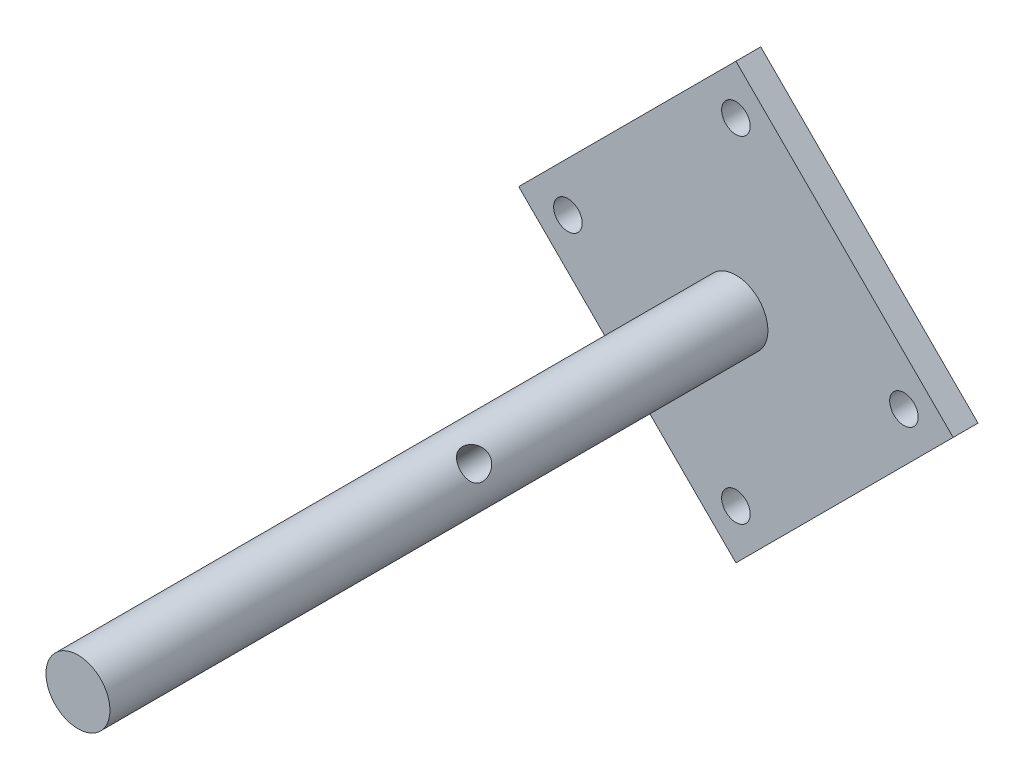
ISO-10303-21;
HEADER;
FILE_DESCRIPTION(('STEP AP214'),'2;1');
FILE_NAME('part.step','',(''),(''),'','','');
FILE_SCHEMA(('AUTOMOTIVE_DESIGN { 1 0 10303 214 1 1 1 1 }'));
ENDSEC;
DATA;
#1=APPLICATION_CONTEXT('core data for automotive mechanical design processes');
#2=APPLICATION_PROTOCOL_DEFINITION('international standard','automotive_design',2000,#1);
#3=PRODUCT_CONTEXT('',#1,'mechanical');
#4=PRODUCT('Part','Part','',(#3));
#5=PRODUCT_RELATED_PRODUCT_CATEGORY('part','',(#4));
#6=PRODUCT_DEFINITION_FORMATION('','',#4);
#7=PRODUCT_DEFINITION_CONTEXT('part definition',#1,'design');
#8=PRODUCT_DEFINITION('design','',#6,#7);
#9=PRODUCT_DEFINITION_SHAPE('','',#8);
#10=(LENGTH_UNIT() NAMED_UNIT(*) SI_UNIT(.MILLI.,.METRE.));
#11=(NAMED_UNIT(*) PLANE_ANGLE_UNIT() SI_UNIT($,.RADIAN.));
#12=(NAMED_UNIT(*) SI_UNIT($,.STERADIAN.) SOLID_ANGLE_UNIT());
#13=UNCERTAINTY_MEASURE_WITH_UNIT(LENGTH_MEASURE(1.E-05),#10,'distance_accuracy_value','');
#14=(GEOMETRIC_REPRESENTATION_CONTEXT(3) GLOBAL_UNCERTAINTY_ASSIGNED_CONTEXT((#13)) GLOBAL_UNIT_ASSIGNED_CONTEXT((#10,
#11,#12)) REPRESENTATION_CONTEXT('',''));
#15=CARTESIAN_POINT('',(0.,0.,0.));
#16=DIRECTION('',(0.,0.,1.));
#17=DIRECTION('',(1.,0.,0.));
#18=AXIS2_PLACEMENT_3D('',#15,#16,#17);
#19=CARTESIAN_POINT('',(0.,0.,2.));
#20=DIRECTION('',(0.,0.,-1.));
#21=DIRECTION('',(-1.,0.,0.));
#22=AXIS2_PLACEMENT_3D('',#19,#20,#21);
#23=PLANE('',#22);
#24=CARTESIAN_POINT('',(-1.41758106618801E-13,13.5337118032324,2.));
#25=DIRECTION('',(0.,0.,-1.));
#26=DIRECTION('',(-1.,0.,0.));
#27=AXIS2_PLACEMENT_3D('',#24,#25,#26);
#28=CIRCLE('',#27,1.15);
#29=CARTESIAN_POINT('',(-1.15000000000014,13.5337118032324,2.));
#30=VERTEX_POINT('',#29);
#31=EDGE_CURVE('E112',#30,#30,#28,.T.);
#32=ORIENTED_EDGE('',*,*,#31,.T.);
#33=EDGE_LOOP('',(#32));
#34=FACE_BOUND('',#33,.T.);
#35=CARTESIAN_POINT('',(13.5337118032324,0.,2.));
#36=DIRECTION('',(0.,0.,-1.));
#37=DIRECTION('',(-1.,0.,0.));
#38=AXIS2_PLACEMENT_3D('',#35,#36,#37);
#39=CIRCLE('',#38,1.15);
#40=CARTESIAN_POINT('',(12.3837118032324,0.,2.));
#41=VERTEX_POINT('',#40);
#42=EDGE_CURVE('E118',#41,#41,#39,.T.);
#43=ORIENTED_EDGE('',*,*,#42,.T.);
#44=EDGE_LOOP('',(#43));
#45=FACE_BOUND('',#44,.T.);
#46=CARTESIAN_POINT('',(0.,-13.5337118032324,2.));
#47=DIRECTION('',(0.,0.,-1.));
#48=DIRECTION('',(-1.,0.,0.));
#49=AXIS2_PLACEMENT_3D('',#46,#47,#48);
#50=CIRCLE('',#49,1.15);
#51=CARTESIAN_POINT('',(-1.14999999999995,-13.5337118032324,2.));
#52=VERTEX_POINT('',#51);
#53=EDGE_CURVE('E124',#52,#52,#50,.T.);
#54=ORIENTED_EDGE('',*,*,#53,.T.);
#55=EDGE_LOOP('',(#54));
#56=FACE_BOUND('',#55,.T.);
#57=CARTESIAN_POINT('',(-13.5337118032324,0.,2.));
#58=DIRECTION('',(0.,0.,-1.));
#59=DIRECTION('',(-1.,0.,0.));
#60=AXIS2_PLACEMENT_3D('',#57,#58,#59);
#61=CIRCLE('',#60,1.15);
#62=CARTESIAN_POINT('',(-14.6837118032324,0.,2.));
#63=VERTEX_POINT('',#62);
#64=EDGE_CURVE('E130',#63,#63,#61,.T.);
#65=ORIENTED_EDGE('',*,*,#64,.T.);
#66=EDGE_LOOP('',(#65));
#67=FACE_BOUND('',#66,.T.);
#68=CARTESIAN_POINT('',(0.,0.,2.));
#69=DIRECTION('',(0.,0.,-1.));
#70=DIRECTION('',(-1.,0.,0.));
#71=AXIS2_PLACEMENT_3D('',#68,#69,#70);
#72=CIRCLE('',#71,2.575);
#73=CARTESIAN_POINT('',(-2.575,0.,2.));
#74=VERTEX_POINT('',#73);
#75=EDGE_CURVE('E136',#74,#74,#72,.T.);
#76=ORIENTED_EDGE('',*,*,#75,.T.);
#77=EDGE_LOOP('',(#76));
#78=FACE_BOUND('',#77,.T.);
#79=DIRECTION('',(0.707106781186548,-0.707106781186548,0.));
#80=VECTOR('',#79,1.);
#81=CARTESIAN_POINT('',(0.,-17.5,2.));
#82=LINE('',#81,#80);
#83=CARTESIAN_POINT('',(-17.5,0.,2.));
#84=VERTEX_POINT('',#83);
#85=CARTESIAN_POINT('',(0.,-17.5,2.));
#86=VERTEX_POINT('',#85);
#87=EDGE_CURVE('E102',#84,#86,#82,.T.);
#88=ORIENTED_EDGE('',*,*,#87,.T.);
#89=DIRECTION('',(0.707106781186548,0.707106781186547,0.));
#90=VECTOR('',#89,1.);
#91=CARTESIAN_POINT('',(17.5,0.,2.));
#92=LINE('',#91,#90);
#93=CARTESIAN_POINT('',(17.5,0.,2.));
#94=VERTEX_POINT('',#93);
#95=EDGE_CURVE('E100',#86,#94,#92,.T.);
#96=ORIENTED_EDGE('',*,*,#95,.T.);
#97=DIRECTION('',(-0.707106781186548,0.707106781186548,0.));
#98=VECTOR('',#97,1.);
#99=CARTESIAN_POINT('',(0.,17.5,2.));
#100=LINE('',#99,#98);
#101=CARTESIAN_POINT('',(0.,17.5,2.));
#102=VERTEX_POINT('',#101);
#103=EDGE_CURVE('E57',#94,#102,#100,.T.);
#104=ORIENTED_EDGE('',*,*,#103,.T.);
#105=DIRECTION('',(-0.707106781186548,-0.707106781186548,0.));
#106=VECTOR('',#105,1.);
#107=CARTESIAN_POINT('',(-17.5,0.,2.));
#108=LINE('',#107,#106);
#109=EDGE_CURVE('E92',#102,#84,#108,.T.);
#110=ORIENTED_EDGE('',*,*,#109,.T.);
#111=EDGE_LOOP('',(#88,#96,#104,#110));
#112=FACE_BOUND('',#111,.T.);
#113=ADVANCED_FACE('F36',(#34,#45,#56,#67,#78,#112),#23,.F.);
#114=CARTESIAN_POINT('',(0.,0.,0.));
#115=DIRECTION('',(0.,0.,1.));
#116=DIRECTION('',(1.,0.,0.));
#117=AXIS2_PLACEMENT_3D('',#114,#115,#116);
#118=PLANE('',#117);
#119=CARTESIAN_POINT('',(-1.41758106618801E-13,13.5337118032324,0.));
#120=DIRECTION('',(0.,0.,-1.));
#121=DIRECTION('',(-1.,0.,0.));
#122=AXIS2_PLACEMENT_3D('',#119,#120,#121);
#123=CIRCLE('',#122,1.15);
#124=CARTESIAN_POINT('',(-1.15000000000014,13.5337118032324,0.));
#125=VERTEX_POINT('',#124);
#126=EDGE_CURVE('E106',#125,#125,#123,.T.);
#127=ORIENTED_EDGE('',*,*,#126,.F.);
#128=EDGE_LOOP('',(#127));
#129=FACE_BOUND('',#128,.T.);
#130=CARTESIAN_POINT('',(13.5337118032324,0.,0.));
#131=DIRECTION('',(0.,0.,-1.));
#132=DIRECTION('',(-1.,0.,0.));
#133=AXIS2_PLACEMENT_3D('',#130,#131,#132);
#134=CIRCLE('',#133,1.15);
#135=CARTESIAN_POINT('',(12.3837118032324,0.,0.));
#136=VERTEX_POINT('',#135);
#137=EDGE_CURVE('E115',#136,#136,#134,.T.);
#138=ORIENTED_EDGE('',*,*,#137,.F.);
#139=EDGE_LOOP('',(#138));
#140=FACE_BOUND('',#139,.T.);
#141=CARTESIAN_POINT('',(0.,-13.5337118032324,0.));
#142=DIRECTION('',(0.,0.,-1.));
#143=DIRECTION('',(-1.,0.,0.));
#144=AXIS2_PLACEMENT_3D('',#141,#142,#143);
#145=CIRCLE('',#144,1.15);
#146=CARTESIAN_POINT('',(-1.14999999999995,-13.5337118032324,0.));
#147=VERTEX_POINT('',#146);
#148=EDGE_CURVE('E121',#147,#147,#145,.T.);
#149=ORIENTED_EDGE('',*,*,#148,.F.);
#150=EDGE_LOOP('',(#149));
#151=FACE_BOUND('',#150,.T.);
#152=CARTESIAN_POINT('',(-13.5337118032324,0.,0.));
#153=DIRECTION('',(0.,0.,-1.));
#154=DIRECTION('',(-1.,0.,0.));
#155=AXIS2_PLACEMENT_3D('',#152,#153,#154);
#156=CIRCLE('',#155,1.15);
#157=CARTESIAN_POINT('',(-14.6837118032324,0.,0.));
#158=VERTEX_POINT('',#157);
#159=EDGE_CURVE('E127',#158,#158,#156,.T.);
#160=ORIENTED_EDGE('',*,*,#159,.F.);
#161=EDGE_LOOP('',(#160));
#162=FACE_BOUND('',#161,.T.);
#163=DIRECTION('',(0.707106781186548,-0.707106781186548,0.));
#164=VECTOR('',#163,1.);
#165=CARTESIAN_POINT('',(-8.75,-8.75,0.));
#166=LINE('',#165,#164);
#167=CARTESIAN_POINT('',(-17.5,0.,0.));
#168=VERTEX_POINT('',#167);
#169=CARTESIAN_POINT('',(0.,-17.5,0.));
#170=VERTEX_POINT('',#169);
#171=EDGE_CURVE('E12',#168,#170,#166,.T.);
#172=ORIENTED_EDGE('',*,*,#171,.F.);
#173=DIRECTION('',(-0.707106781186548,-0.707106781186548,0.));
#174=VECTOR('',#173,1.);
#175=CARTESIAN_POINT('',(-8.75,8.75,0.));
#176=LINE('',#175,#174);
#177=CARTESIAN_POINT('',(0.,17.5,0.));
#178=VERTEX_POINT('',#177);
#179=EDGE_CURVE('E49',#178,#168,#176,.T.);
#180=ORIENTED_EDGE('',*,*,#179,.F.);
#181=DIRECTION('',(-0.707106781186548,0.707106781186548,0.));
#182=VECTOR('',#181,1.);
#183=CARTESIAN_POINT('',(8.75,8.75,0.));
#184=LINE('',#183,#182);
#185=CARTESIAN_POINT('',(17.5,0.,0.));
#186=VERTEX_POINT('',#185);
#187=EDGE_CURVE('E85',#186,#178,#184,.T.);
#188=ORIENTED_EDGE('',*,*,#187,.F.);
#189=DIRECTION('',(0.707106781186548,0.707106781186547,0.));
#190=VECTOR('',#189,1.);
#191=CARTESIAN_POINT('',(8.75,-8.75,0.));
#192=LINE('',#191,#190);
#193=EDGE_CURVE('E139',#170,#186,#192,.T.);
#194=ORIENTED_EDGE('',*,*,#193,.F.);
#195=EDGE_LOOP('',(#172,#180,#188,#194));
#196=FACE_BOUND('',#195,.T.);
#197=ADVANCED_FACE('F182',(#129,#140,#151,#162,#196),#118,.F.);
#198=CARTESIAN_POINT('',(0.,0.,55.));
#199=DIRECTION('',(0.,0.,-1.));
#200=DIRECTION('',(-1.,0.,0.));
#201=AXIS2_PLACEMENT_3D('',#198,#199,#200);
#202=CYLINDRICAL_SURFACE('',#201,2.575);
#203=CARTESIAN_POINT('',(-2.44230216707654,-0.815956570347482,24.85));
#204=CARTESIAN_POINT('',(-2.44230229205032,-0.815967693503036,24.910870444911));
#205=CARTESIAN_POINT('',(-2.44059414727301,-0.821126303930703,24.9718197167185));
#206=CARTESIAN_POINT('',(-2.43367863255246,-0.841391312170934,25.0919308382429));
#207=CARTESIAN_POINT('',(-2.42846244373117,-0.856522778842297,25.1510877895956));
#208=CARTESIAN_POINT('',(-2.41433927450689,-0.895553577183591,25.2656467819259));
#209=CARTESIAN_POINT('',(-2.40544884923006,-0.919413525966076,25.3210643848195));
#210=CARTESIAN_POINT('',(-2.38366538729612,-0.97449376775129,25.4272143845457));
#211=CARTESIAN_POINT('',(-2.37077288629775,-1.00571307560447,25.4779474072087));
#212=CARTESIAN_POINT('',(-2.33962231658518,-1.07627697847228,25.5769540617256));
#213=CARTESIAN_POINT('',(-2.32106949298697,-1.11601832652772,25.6248523466214));
#214=CARTESIAN_POINT('',(-2.27853950747013,-1.20046544035512,25.7133386023638));
#215=CARTESIAN_POINT('',(-2.25456007416,-1.2451732809285,25.7539234992645));
#216=CARTESIAN_POINT('',(-2.1994663971602,-1.34020003846615,25.8286486415334));
#217=CARTESIAN_POINT('',(-2.16804996972533,-1.39068898656692,25.8623531138322));
#218=CARTESIAN_POINT('',(-2.09881201509723,-1.49312598880938,25.9193746520003));
#219=CARTESIAN_POINT('',(-2.06099374739382,-1.5450732892609,25.9426969821007));
#220=CARTESIAN_POINT('',(-1.98186231466786,-1.64519782144284,25.9768897451093));
#221=CARTESIAN_POINT('',(-1.94088490155673,-1.69341727634032,25.9884110995201));
#222=CARTESIAN_POINT('',(-1.85471181213803,-1.78737941315889,26.0007919226578));
#223=CARTESIAN_POINT('',(-1.80951813061103,-1.83312325030793,26.0016564077949));
#224=CARTESIAN_POINT('',(-1.71966072364069,-1.9175320781486,25.9930098860673));
#225=CARTESIAN_POINT('',(-1.67517978032919,-1.95646825680938,25.9842181446084));
#226=CARTESIAN_POINT('',(-1.58528570080669,-2.02999193323595,25.9577599644469));
#227=CARTESIAN_POINT('',(-1.53987249577562,-2.0645791086033,25.9400928682847));
#228=CARTESIAN_POINT('',(-1.44891782610859,-2.12942055991544,25.8961973916452));
#229=CARTESIAN_POINT('',(-1.40338493517202,-2.15960085167223,25.869842763144));
#230=CARTESIAN_POINT('',(-1.31438464014879,-2.21489666674116,25.8094566744392));
#231=CARTESIAN_POINT('',(-1.27091799698547,-2.24001033507852,25.7754224122203));
#232=CARTESIAN_POINT('',(-1.18417552792668,-2.28713335263395,25.6975202919936));
#233=CARTESIAN_POINT('',(-1.14118762060858,-2.30873915540064,25.653087000434));
#234=CARTESIAN_POINT('',(-1.06104303055869,-2.34665343447006,25.5572104052701));
#235=CARTESIAN_POINT('',(-1.02388930771355,-2.36295922635057,25.5057635680148));
#236=CARTESIAN_POINT('',(-0.955820942090325,-2.39132830479315,25.3945978587244));
#237=CARTESIAN_POINT('',(-0.9252376682756,-2.40318237216961,25.3346207254562));
#238=CARTESIAN_POINT('',(-0.874476149503827,-2.42211867222991,25.2097198345461));
#239=CARTESIAN_POINT('',(-0.854289197371958,-2.42920489962645,25.1448002687971));
#240=CARTESIAN_POINT('',(-0.827010300284866,-2.43862139096956,25.0167695888877));
#241=CARTESIAN_POINT('',(-0.819088998146456,-2.44125411039466,24.9538583311139));
#242=CARTESIAN_POINT('',(-0.814352966617804,-2.44283918777807,24.8275846431277));
#243=CARTESIAN_POINT('',(-0.817533330297187,-2.44179317173396,24.7642224245956));
#244=CARTESIAN_POINT('',(-0.83402705285339,-2.43620334129821,24.6440955545225));
#245=CARTESIAN_POINT('',(-0.846527259063101,-2.43193990042399,24.5872028555859));
#246=CARTESIAN_POINT('',(-0.879846066989332,-2.42008391869363,24.4762796674118));
#247=CARTESIAN_POINT('',(-0.900666817752388,-2.4124905177195,24.4222499217099));
#248=CARTESIAN_POINT('',(-0.950534249478958,-2.39329304801796,24.3158624203313));
#249=CARTESIAN_POINT('',(-0.979908275282838,-2.38152422155535,24.2636886362834));
#250=CARTESIAN_POINT('',(-1.04497310563761,-2.35370073530953,24.1646908019159));
#251=CARTESIAN_POINT('',(-1.08066689704016,-2.33764404716254,24.1178692984897));
#252=CARTESIAN_POINT('',(-1.16059042155438,-2.29908772502068,24.0262119432647));
#253=CARTESIAN_POINT('',(-1.20531083270636,-2.27611718336404,23.9819994088452));
#254=CARTESIAN_POINT('',(-1.29871448080867,-2.22414472334764,23.902093178346));
#255=CARTESIAN_POINT('',(-1.3473983005338,-2.19514191703264,23.8664007380955));
#256=CARTESIAN_POINT('',(-1.44724556588566,-2.13064886155164,23.8043642178896));
#257=CARTESIAN_POINT('',(-1.49842752293683,-2.09510205936836,23.7781080278481));
#258=CARTESIAN_POINT('',(-1.60071355027658,-2.01802626651716,23.7365052933392));
#259=CARTESIAN_POINT('',(-1.65181764997205,-1.97650144863442,23.7211511829665));
#260=CARTESIAN_POINT('',(-1.74791196010937,-1.89187870385846,23.7028412353533));
#261=CARTESIAN_POINT('',(-1.79306786263542,-1.84915729935902,23.6990102789529));
#262=CARTESIAN_POINT('',(-1.88001049850373,-1.76068969939469,23.701424349401));
#263=CARTESIAN_POINT('',(-1.92179798884834,-1.71494418778433,23.7076671056611));
#264=CARTESIAN_POINT('',(-1.99908280502578,-1.62409770959691,23.729427860044));
#265=CARTESIAN_POINT('',(-2.03477885811182,-1.57906077200015,23.7445147024681));
#266=CARTESIAN_POINT('',(-2.10150381045183,-1.48910898974436,23.7830287594553));
#267=CARTESIAN_POINT('',(-2.13253189533651,-1.44419416772847,23.8064574269306));
#268=CARTESIAN_POINT('',(-2.19103061255101,-1.35389682437918,23.8621697535039));
#269=CARTESIAN_POINT('',(-2.21827305367588,-1.3085871967812,23.8948100088084));
#270=CARTESIAN_POINT('',(-2.26754880579968,-1.22121561154545,23.967529865233));
#271=CARTESIAN_POINT('',(-2.28957988689319,-1.17915504932585,24.0076126379087));
#272=CARTESIAN_POINT('',(-2.33030037286008,-1.09663466831327,24.0978207346278));
#273=CARTESIAN_POINT('',(-2.34858410610754,-1.05656887017439,24.1484915185907));
#274=CARTESIAN_POINT('',(-2.37994322139139,-0.983903947531986,24.2564480677369));
#275=CARTESIAN_POINT('',(-2.39301531673661,-0.951309540309843,24.3137379779593));
#276=CARTESIAN_POINT('',(-2.41447624674776,-0.895451116273463,24.433877462531));
#277=CARTESIAN_POINT('',(-2.42284286501819,-0.872231504495328,24.4967518143099));
#278=CARTESIAN_POINT('',(-2.43516386357489,-0.837233478362006,24.6258898827281));
#279=CARTESIAN_POINT('',(-2.43913305567671,-0.825416673483781,24.6921414302361));
#280=CARTESIAN_POINT('',(-2.44187533679843,-0.817231232678092,24.789175054462));
#281=CARTESIAN_POINT('',(-2.44230210461615,-0.81595101112784,24.8195776822229));
#282=CARTESIAN_POINT('',(-2.44230216707654,-0.815956570347482,24.85));
#283=B_SPLINE_CURVE_WITH_KNOTS('',3,(#203,#204,#205,#206,#207,#208,#209,#210,#211,#212,#213,
#214,#215,#216,#217,#218,#219,#220,#221,#222,#223,#224,#225,#226,#227,#228,#229,#230,#231,#232,
#233,#234,#235,#236,#237,#238,#239,#240,#241,#242,#243,#244,#245,#246,#247,#248,#249,#250,#251,
#252,#253,#254,#255,#256,#257,#258,#259,#260,#261,#262,#263,#264,#265,#266,#267,#268,#269,#270,
#271,#272,#273,#274,#275,#276,#277,#278,#279,#280,#281,#282),.UNSPECIFIED.,.T.,.F.,(4,2,2,2,2,2,
2,2,2,2,2,2,2,2,2,2,2,2,2,2,2,2,2,2,2,2,2,2,2,2,2,2,2,2,2,2,2,2,2,4),(0.,0.182514392894476,
0.365489332670996,0.547648672392826,0.729783641461598,0.923780289121394,1.11785828776244,
1.32186238634187,1.52576292716395,1.71768701910198,1.90952076492272,2.08797821093949,
2.26644887849663,2.44763671111806,2.6288907597043,2.82450410509649,3.02021637358831,
3.22422764454421,3.42806777203722,3.61740785917117,3.80666426868632,3.98109761666227,
4.15557604677302,4.33788788357654,4.52028611584513,4.72021430996731,4.92017195456897,
5.12194649651142,5.32358087224768,5.50945816374597,5.69529356484336,5.87274506064694,
6.05022747865862,6.23584341985723,6.42153864175819,6.62201741953473,6.82262242893026,
7.0241667884447,7.22503020404467,7.31624870700851),.UNSPECIFIED.);
#284=CARTESIAN_POINT('',(-2.44230216707654,-0.815956570347482,24.85));
#285=VERTEX_POINT('',#284);
#286=EDGE_CURVE('E41',#285,#285,#283,.T.);
#287=ORIENTED_EDGE('',*,*,#286,.T.);
#288=EDGE_LOOP('',(#287));
#289=FACE_BOUND('',#288,.T.);
#290=CARTESIAN_POINT('',(0.815956570347484,2.44230216707654,24.85));
#291=CARTESIAN_POINT('',(0.815967693503039,2.44230229205033,24.789129555089));
#292=CARTESIAN_POINT('',(0.821126303930705,2.44059414727301,24.7281802832815));
#293=CARTESIAN_POINT('',(0.841391312170933,2.43367863255246,24.6080691617571));
#294=CARTESIAN_POINT('',(0.856522778842297,2.42846244373117,24.5489122104044));
#295=CARTESIAN_POINT('',(0.895553577183593,2.41433927450689,24.4343532180741));
#296=CARTESIAN_POINT('',(0.919413525966079,2.40544884923006,24.3789356151805));
#297=CARTESIAN_POINT('',(0.974493767751293,2.38366538729612,24.2727856154542));
#298=CARTESIAN_POINT('',(1.00571307560448,2.37077288629775,24.2220525927913));
#299=CARTESIAN_POINT('',(1.07627697847228,2.33962231658517,24.1230459382744));
#300=CARTESIAN_POINT('',(1.11601832652772,2.32106949298697,24.0751476533786));
#301=CARTESIAN_POINT('',(1.20046544035512,2.27853950747013,23.9866613976362));
#302=CARTESIAN_POINT('',(1.2451732809285,2.25456007416,23.9460765007355));
#303=CARTESIAN_POINT('',(1.34020003846615,2.1994663971602,23.8713513584666));
#304=CARTESIAN_POINT('',(1.39068898656692,2.16804996972533,23.8376468861678));
#305=CARTESIAN_POINT('',(1.49312598880938,2.09881201509723,23.7806253479997));
#306=CARTESIAN_POINT('',(1.5450732892609,2.06099374739382,23.7573030178993));
#307=CARTESIAN_POINT('',(1.64519782144284,1.98186231466786,23.7231102548907));
#308=CARTESIAN_POINT('',(1.69341727634032,1.94088490155673,23.7115889004799));
#309=CARTESIAN_POINT('',(1.78737941315889,1.85471181213803,23.6992080773422));
#310=CARTESIAN_POINT('',(1.83312325030793,1.80951813061103,23.6983435922051));
#311=CARTESIAN_POINT('',(1.9175320781486,1.71966072364069,23.7069901139327));
#312=CARTESIAN_POINT('',(1.95646825680938,1.67517978032919,23.7157818553916));
#313=CARTESIAN_POINT('',(2.02999193323595,1.58528570080669,23.7422400355531));
#314=CARTESIAN_POINT('',(2.0645791086033,1.53987249577562,23.7599071317153));
#315=CARTESIAN_POINT('',(2.12942055991544,1.44891782610859,23.8038026083548));
#316=CARTESIAN_POINT('',(2.15960085167223,1.40338493517202,23.830157236856));
#317=CARTESIAN_POINT('',(2.21489666674116,1.31438464014879,23.8905433255608));
#318=CARTESIAN_POINT('',(2.24001033507852,1.27091799698547,23.9245775877797));
#319=CARTESIAN_POINT('',(2.28713335263395,1.18417552792667,24.0024797080064));
#320=CARTESIAN_POINT('',(2.30873915540064,1.14118762060858,24.046912999566));
#321=CARTESIAN_POINT('',(2.34665343447006,1.06104303055869,24.1427895947299));
#322=CARTESIAN_POINT('',(2.36295922635057,1.02388930771354,24.1942364319852));
#323=CARTESIAN_POINT('',(2.39132830479315,0.955820942090325,24.3054021412756));
#324=CARTESIAN_POINT('',(2.40318237216961,0.9252376682756,24.3653792745438));
#325=CARTESIAN_POINT('',(2.42211867222991,0.874476149503826,24.4902801654539));
#326=CARTESIAN_POINT('',(2.42920489962645,0.854289197371958,24.5551997312029));
#327=CARTESIAN_POINT('',(2.43862139096956,0.827010300284866,24.6832304111123));
#328=CARTESIAN_POINT('',(2.44125411039466,0.819088998146457,24.7461416688861));
#329=CARTESIAN_POINT('',(2.44283918777807,0.814352966617804,24.8724153568722));
#330=CARTESIAN_POINT('',(2.44179317173396,0.817533330297187,24.9357775754044));
#331=CARTESIAN_POINT('',(2.43620334129821,0.83402705285339,25.0559044454775));
#332=CARTESIAN_POINT('',(2.43193990042399,0.846527259063101,25.1127971444141));
#333=CARTESIAN_POINT('',(2.42008391869363,0.879846066989332,25.2237203325882));
#334=CARTESIAN_POINT('',(2.4124905177195,0.900666817752387,25.2777500782901));
#335=CARTESIAN_POINT('',(2.39329304801796,0.950534249478956,25.3841375796687));
#336=CARTESIAN_POINT('',(2.38152422155535,0.979908275282837,25.4363113637166));
#337=CARTESIAN_POINT('',(2.35370073530953,1.04497310563761,25.5353091980841));
#338=CARTESIAN_POINT('',(2.33764404716254,1.08066689704016,25.5821307015103));
#339=CARTESIAN_POINT('',(2.29908772502068,1.16059042155438,25.6737880567353));
#340=CARTESIAN_POINT('',(2.27611718336404,1.20531083270636,25.7180005911548));
#341=CARTESIAN_POINT('',(2.22414472334764,1.29871448080867,25.797906821654));
#342=CARTESIAN_POINT('',(2.19514191703264,1.3473983005338,25.8335992619045));
#343=CARTESIAN_POINT('',(2.13064886155164,1.44724556588566,25.8956357821104));
#344=CARTESIAN_POINT('',(2.09510205936836,1.49842752293683,25.9218919721519));
#345=CARTESIAN_POINT('',(2.01802626651716,1.60071355027658,25.9634947066608));
#346=CARTESIAN_POINT('',(1.97650144863442,1.65181764997205,25.9788488170335));
#347=CARTESIAN_POINT('',(1.89187870385846,1.74791196010937,25.9971587646467));
#348=CARTESIAN_POINT('',(1.84915729935902,1.79306786263542,26.0009897210471));
#349=CARTESIAN_POINT('',(1.76068969939469,1.88001049850373,25.998575650599));
#350=CARTESIAN_POINT('',(1.71494418778433,1.92179798884834,25.9923328943389));
#351=CARTESIAN_POINT('',(1.62409770959692,1.99908280502578,25.970572139956));
#352=CARTESIAN_POINT('',(1.57906077200016,2.03477885811182,25.9554852975319));
#353=CARTESIAN_POINT('',(1.48910898974436,2.10150381045183,25.9169712405447));
#354=CARTESIAN_POINT('',(1.44419416772847,2.13253189533651,25.8935425730694));
#355=CARTESIAN_POINT('',(1.35389682437918,2.19103061255101,25.8378302464961));
#356=CARTESIAN_POINT('',(1.3085871967812,2.21827305367588,25.8051899911916));
#357=CARTESIAN_POINT('',(1.22121561154546,2.26754880579968,25.732470134767));
#358=CARTESIAN_POINT('',(1.17915504932586,2.28957988689319,25.6923873620913));
#359=CARTESIAN_POINT('',(1.09663466831327,2.33030037286008,25.6021792653722));
#360=CARTESIAN_POINT('',(1.05656887017439,2.34858410610754,25.5515084814093));
#361=CARTESIAN_POINT('',(0.983903947531988,2.37994322139139,25.4435519322631));
#362=CARTESIAN_POINT('',(0.951309540309845,2.39301531673661,25.3862620220407));
#363=CARTESIAN_POINT('',(0.895451116273465,2.41447624674776,25.266122537469));
#364=CARTESIAN_POINT('',(0.872231504495332,2.42284286501819,25.2032481856901));
#365=CARTESIAN_POINT('',(0.837233478362008,2.43516386357489,25.0741101172719));
#366=CARTESIAN_POINT('',(0.82541667348378,2.43913305567671,25.0078585697639));
#367=CARTESIAN_POINT('',(0.817231232678093,2.44187533679843,24.910824945538));
#368=CARTESIAN_POINT('',(0.815951011127842,2.44230210461615,24.8804223177771));
#369=CARTESIAN_POINT('',(0.815956570347484,2.44230216707654,24.85));
#370=B_SPLINE_CURVE_WITH_KNOTS('',3,(#290,#291,#292,#293,#294,#295,#296,#297,#298,#299,#300,
#301,#302,#303,#304,#305,#306,#307,#308,#309,#310,#311,#312,#313,#314,#315,#316,#317,#318,#319,
#320,#321,#322,#323,#324,#325,#326,#327,#328,#329,#330,#331,#332,#333,#334,#335,#336,#337,#338,
#339,#340,#341,#342,#343,#344,#345,#346,#347,#348,#349,#350,#351,#352,#353,#354,#355,#356,#357,
#358,#359,#360,#361,#362,#363,#364,#365,#366,#367,#368,#369),.UNSPECIFIED.,.T.,.F.,(4,2,2,2,2,2,
2,2,2,2,2,2,2,2,2,2,2,2,2,2,2,2,2,2,2,2,2,2,2,2,2,2,2,2,2,2,2,2,2,4),(0.,0.182514392894472,
0.365489332670996,0.547648672392831,0.729783641461598,0.923780289121393,1.11785828776244,
1.32186238634187,1.52576292716395,1.71768701910198,1.90952076492272,2.08797821093949,
2.26644887849663,2.44763671111806,2.6288907597043,2.82450410509649,3.02021637358831,
3.22422764454421,3.42806777203722,3.61740785917117,3.80666426868632,3.98109761666227,
4.15557604677302,4.33788788357654,4.52028611584513,4.72021430996731,4.92017195456897,
5.12194649651141,5.32358087224768,5.50945816374596,5.69529356484336,5.87274506064694,
6.05022747865861,6.23584341985722,6.42153864175819,6.62201741953473,6.82262242893026,
7.02416678844469,7.22503020404466,7.31624870700851),.UNSPECIFIED.);
#371=CARTESIAN_POINT('',(0.815956570347484,2.44230216707654,24.85));
#372=VERTEX_POINT('',#371);
#373=EDGE_CURVE('E142',#372,#372,#370,.T.);
#374=ORIENTED_EDGE('',*,*,#373,.T.);
#375=EDGE_LOOP('',(#374));
#376=FACE_BOUND('',#375,.T.);
#377=CARTESIAN_POINT('',(0.,0.,55.));
#378=DIRECTION('',(0.,0.,1.));
#379=DIRECTION('',(1.,0.,0.));
#380=AXIS2_PLACEMENT_3D('',#377,#378,#379);
#381=CIRCLE('',#380,2.575);
#382=CARTESIAN_POINT('',(2.575,0.,55.));
#383=VERTEX_POINT('',#382);
#384=EDGE_CURVE('E133',#383,#383,#381,.T.);
#385=ORIENTED_EDGE('',*,*,#384,.F.);
#386=EDGE_LOOP('',(#385));
#387=FACE_BOUND('',#386,.T.);
#388=ORIENTED_EDGE('',*,*,#75,.F.);
#389=EDGE_LOOP('',(#388));
#390=FACE_BOUND('',#389,.T.);
#391=ADVANCED_FACE('F38',(#289,#376,#387,#390),#202,.T.);
#392=CARTESIAN_POINT('',(0.,0.,55.));
#393=DIRECTION('',(0.,0.,1.));
#394=DIRECTION('',(1.,0.,0.));
#395=AXIS2_PLACEMENT_3D('',#392,#393,#394);
#396=PLANE('',#395);
#397=ORIENTED_EDGE('',*,*,#384,.T.);
#398=EDGE_LOOP('',(#397));
#399=FACE_BOUND('',#398,.T.);
#400=ADVANCED_FACE('F178',(#399),#396,.T.);
#401=CARTESIAN_POINT('',(-13.5337118032324,0.,5.));
#402=DIRECTION('',(0.,0.,-1.));
#403=DIRECTION('',(-1.,0.,0.));
#404=AXIS2_PLACEMENT_3D('',#401,#402,#403);
#405=CYLINDRICAL_SURFACE('',#404,1.15);
#406=ORIENTED_EDGE('',*,*,#159,.T.);
#407=EDGE_LOOP('',(#406));
#408=FACE_BOUND('',#407,.T.);
#409=ORIENTED_EDGE('',*,*,#64,.F.);
#410=EDGE_LOOP('',(#409));
#411=FACE_BOUND('',#410,.T.);
#412=ADVANCED_FACE('F174',(#408,#411),#405,.F.);
#413=CARTESIAN_POINT('',(0.,-13.5337118032324,5.));
#414=DIRECTION('',(0.,0.,-1.));
#415=DIRECTION('',(-1.,0.,0.));
#416=AXIS2_PLACEMENT_3D('',#413,#414,#415);
#417=CYLINDRICAL_SURFACE('',#416,1.15);
#418=ORIENTED_EDGE('',*,*,#148,.T.);
#419=EDGE_LOOP('',(#418));
#420=FACE_BOUND('',#419,.T.);
#421=ORIENTED_EDGE('',*,*,#53,.F.);
#422=EDGE_LOOP('',(#421));
#423=FACE_BOUND('',#422,.T.);
#424=ADVANCED_FACE('F170',(#420,#423),#417,.F.);
#425=CARTESIAN_POINT('',(13.5337118032324,0.,5.));
#426=DIRECTION('',(0.,0.,-1.));
#427=DIRECTION('',(-1.,0.,0.));
#428=AXIS2_PLACEMENT_3D('',#425,#426,#427);
#429=CYLINDRICAL_SURFACE('',#428,1.15);
#430=ORIENTED_EDGE('',*,*,#137,.T.);
#431=EDGE_LOOP('',(#430));
#432=FACE_BOUND('',#431,.T.);
#433=ORIENTED_EDGE('',*,*,#42,.F.);
#434=EDGE_LOOP('',(#433));
#435=FACE_BOUND('',#434,.T.);
#436=ADVANCED_FACE('F166',(#432,#435),#429,.F.);
#437=CARTESIAN_POINT('',(-1.41758106618801E-13,13.5337118032324,5.));
#438=DIRECTION('',(0.,0.,-1.));
#439=DIRECTION('',(-1.,0.,0.));
#440=AXIS2_PLACEMENT_3D('',#437,#438,#439);
#441=CYLINDRICAL_SURFACE('',#440,1.15);
#442=ORIENTED_EDGE('',*,*,#126,.T.);
#443=EDGE_LOOP('',(#442));
#444=FACE_BOUND('',#443,.T.);
#445=ORIENTED_EDGE('',*,*,#31,.F.);
#446=EDGE_LOOP('',(#445));
#447=FACE_BOUND('',#446,.T.);
#448=ADVANCED_FACE('F162',(#444,#447),#441,.F.);
#449=CARTESIAN_POINT('',(0.,-17.5,-3.));
#450=DIRECTION('',(-0.707106781186548,-0.707106781186548,0.));
#451=DIRECTION('',(0.707106781186548,-0.707106781186548,0.));
#452=AXIS2_PLACEMENT_3D('',#449,#450,#451);
#453=PLANE('',#452);
#454=ORIENTED_EDGE('',*,*,#171,.T.);
#455=DIRECTION('',(0.,0.,1.));
#456=VECTOR('',#455,1.);
#457=CARTESIAN_POINT('',(0.,-17.5,-3.));
#458=LINE('',#457,#456);
#459=EDGE_CURVE('E65',#170,#86,#458,.T.);
#460=ORIENTED_EDGE('',*,*,#459,.T.);
#461=ORIENTED_EDGE('',*,*,#87,.F.);
#462=DIRECTION('',(0.,0.,1.));
#463=VECTOR('',#462,1.);
#464=CARTESIAN_POINT('',(-17.5,0.,-3.));
#465=LINE('',#464,#463);
#466=EDGE_CURVE('E88',#168,#84,#465,.T.);
#467=ORIENTED_EDGE('',*,*,#466,.F.);
#468=EDGE_LOOP('',(#454,#460,#461,#467));
#469=FACE_BOUND('',#468,.T.);
#470=ADVANCED_FACE('F155',(#469),#453,.T.);
#471=CARTESIAN_POINT('',(-17.5,0.,-3.));
#472=DIRECTION('',(-0.707106781186548,0.707106781186548,0.));
#473=DIRECTION('',(-0.707106781186548,-0.707106781186548,0.));
#474=AXIS2_PLACEMENT_3D('',#471,#472,#473);
#475=PLANE('',#474);
#476=ORIENTED_EDGE('',*,*,#179,.T.);
#477=ORIENTED_EDGE('',*,*,#466,.T.);
#478=ORIENTED_EDGE('',*,*,#109,.F.);
#479=DIRECTION('',(0.,0.,1.));
#480=VECTOR('',#479,1.);
#481=CARTESIAN_POINT('',(0.,17.5,-3.));
#482=LINE('',#481,#480);
#483=EDGE_CURVE('E81',#178,#102,#482,.T.);
#484=ORIENTED_EDGE('',*,*,#483,.F.);
#485=EDGE_LOOP('',(#476,#477,#478,#484));
#486=FACE_BOUND('',#485,.T.);
#487=ADVANCED_FACE('F93',(#486),#475,.T.);
#488=CARTESIAN_POINT('',(0.,17.5,-3.));
#489=DIRECTION('',(0.707106781186548,0.707106781186548,0.));
#490=DIRECTION('',(-0.707106781186548,0.707106781186548,0.));
#491=AXIS2_PLACEMENT_3D('',#488,#489,#490);
#492=PLANE('',#491);
#493=ORIENTED_EDGE('',*,*,#187,.T.);
#494=ORIENTED_EDGE('',*,*,#483,.T.);
#495=ORIENTED_EDGE('',*,*,#103,.F.);
#496=DIRECTION('',(0.,0.,1.));
#497=VECTOR('',#496,1.);
#498=CARTESIAN_POINT('',(17.5,0.,-3.));
#499=LINE('',#498,#497);
#500=EDGE_CURVE('E89',#186,#94,#499,.T.);
#501=ORIENTED_EDGE('',*,*,#500,.F.);
#502=EDGE_LOOP('',(#493,#494,#495,#501));
#503=FACE_BOUND('',#502,.T.);
#504=ADVANCED_FACE('F83',(#503),#492,.T.);
#505=CARTESIAN_POINT('',(17.5,0.,-3.));
#506=DIRECTION('',(0.707106781186547,-0.707106781186548,0.));
#507=DIRECTION('',(0.707106781186548,0.707106781186547,0.));
#508=AXIS2_PLACEMENT_3D('',#505,#506,#507);
#509=PLANE('',#508);
#510=ORIENTED_EDGE('',*,*,#193,.T.);
#511=ORIENTED_EDGE('',*,*,#500,.T.);
#512=ORIENTED_EDGE('',*,*,#95,.F.);
#513=ORIENTED_EDGE('',*,*,#459,.F.);
#514=EDGE_LOOP('',(#510,#511,#512,#513));
#515=FACE_BOUND('',#514,.T.);
#516=ADVANCED_FACE('F150',(#515),#509,.T.);
#517=CARTESIAN_POINT('',(-5.39213562373094,-5.39213562373094,24.85));
#518=DIRECTION('',(0.707106781186548,0.707106781186547,0.));
#519=DIRECTION('',(-0.707106781186547,0.707106781186548,0.));
#520=AXIS2_PLACEMENT_3D('',#517,#518,#519);
#521=CYLINDRICAL_SURFACE('',#520,1.15);
#522=ORIENTED_EDGE('',*,*,#373,.F.);
#523=EDGE_LOOP('',(#522));
#524=FACE_BOUND('',#523,.T.);
#525=ORIENTED_EDGE('',*,*,#286,.F.);
#526=EDGE_LOOP('',(#525));
#527=FACE_BOUND('',#526,.T.);
#528=ADVANCED_FACE('F146',(#524,#527),#521,.F.);
#529=CLOSED_SHELL('',(#113,#197,#391,#400,#412,#424,#436,#448,#470,#487,#504,#516,#528));
#530=MANIFOLD_SOLID_BREP('B2',#529);
#531=ADVANCED_BREP_SHAPE_REPRESENTATION('',(#18,#530),#14);
#532=SHAPE_DEFINITION_REPRESENTATION(#9,#531);
ENDSEC;
END-ISO-10303-21;
